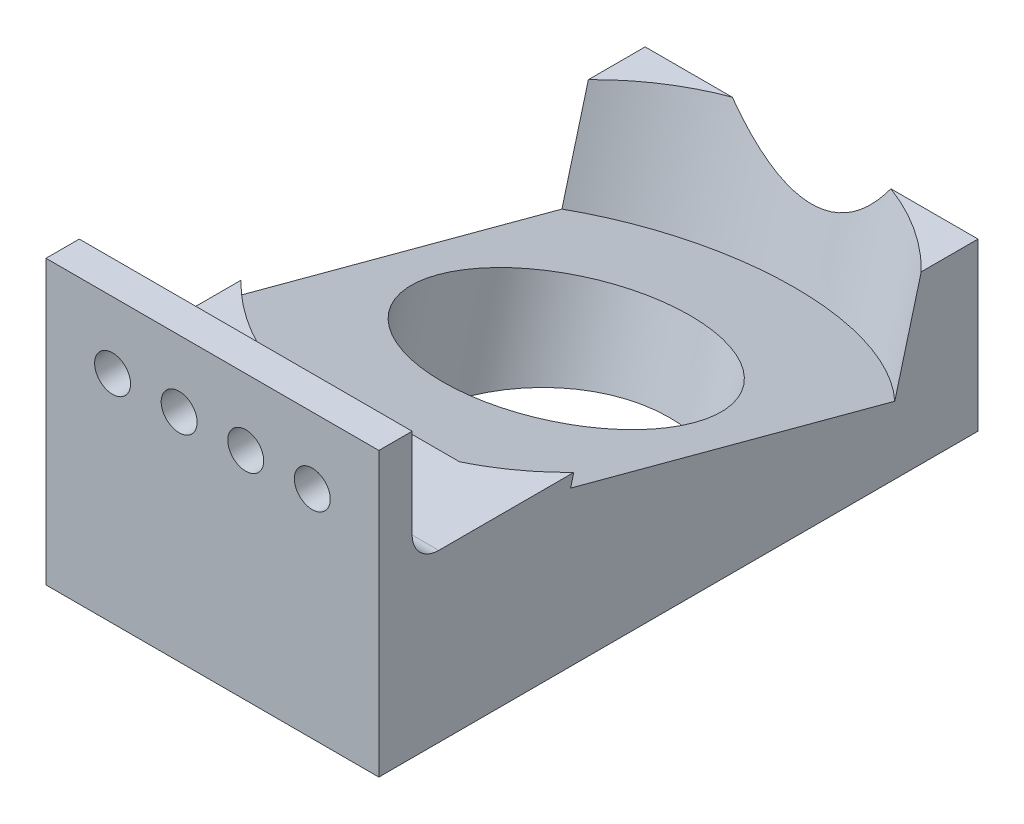
ISO-10303-21;
HEADER;
FILE_DESCRIPTION(('STEP AP214'),'2;1');
FILE_NAME('part.step','',(''),(''),'','','');
FILE_SCHEMA(('AUTOMOTIVE_DESIGN { 1 0 10303 214 1 1 1 1 }'));
ENDSEC;
DATA;
#1=APPLICATION_CONTEXT('core data for automotive mechanical design processes');
#2=APPLICATION_PROTOCOL_DEFINITION('international standard','automotive_design',2000,#1);
#3=PRODUCT_CONTEXT('',#1,'mechanical');
#4=PRODUCT('Part','Part','',(#3));
#5=PRODUCT_RELATED_PRODUCT_CATEGORY('part','',(#4));
#6=PRODUCT_DEFINITION_FORMATION('','',#4);
#7=PRODUCT_DEFINITION_CONTEXT('part definition',#1,'design');
#8=PRODUCT_DEFINITION('design','',#6,#7);
#9=PRODUCT_DEFINITION_SHAPE('','',#8);
#10=(LENGTH_UNIT() NAMED_UNIT(*) SI_UNIT(.MILLI.,.METRE.));
#11=(NAMED_UNIT(*) PLANE_ANGLE_UNIT() SI_UNIT($,.RADIAN.));
#12=(NAMED_UNIT(*) SI_UNIT($,.STERADIAN.) SOLID_ANGLE_UNIT());
#13=UNCERTAINTY_MEASURE_WITH_UNIT(LENGTH_MEASURE(1.E-05),#10,'distance_accuracy_value','');
#14=(GEOMETRIC_REPRESENTATION_CONTEXT(3) GLOBAL_UNCERTAINTY_ASSIGNED_CONTEXT((#13)) GLOBAL_UNIT_ASSIGNED_CONTEXT((#10,
#11,#12)) REPRESENTATION_CONTEXT('',''));
#15=CARTESIAN_POINT('',(0.,0.,0.));
#16=DIRECTION('',(0.,0.,1.));
#17=DIRECTION('',(1.,0.,0.));
#18=AXIS2_PLACEMENT_3D('',#15,#16,#17);
#19=CARTESIAN_POINT('',(31.75,15.875,-53.975));
#20=DIRECTION('',(0.,-1.,0.));
#21=DIRECTION('',(0.,0.,-1.));
#22=AXIS2_PLACEMENT_3D('',#19,#20,#21);
#23=PLANE('',#22);
#24=DIRECTION('',(0.,0.,1.));
#25=VECTOR('',#24,1.);
#26=CARTESIAN_POINT('',(-31.75,15.875,-53.975));
#27=LINE('',#26,#25);
#28=CARTESIAN_POINT('',(-31.75,15.875,-53.975));
#29=VERTEX_POINT('',#28);
#30=CARTESIAN_POINT('',(-31.75,15.875,-43.143798365032));
#31=VERTEX_POINT('',#30);
#32=EDGE_CURVE('E214',#29,#31,#27,.T.);
#33=ORIENTED_EDGE('',*,*,#32,.T.);
#34=CARTESIAN_POINT('',(0.,15.875,-10.0053416035631));
#35=DIRECTION('',(0.,-1.,0.));
#36=DIRECTION('',(0.,0.,1.));
#37=AXIS2_PLACEMENT_3D('',#34,#35,#36);
#38=ELLIPSE('',#37,46.6754265937885,45.085);
#39=CARTESIAN_POINT('',(-15.12729242551,15.875,-53.975));
#40=VERTEX_POINT('',#39);
#41=EDGE_CURVE('E200',#31,#40,#38,.T.);
#42=ORIENTED_EDGE('',*,*,#41,.T.);
#43=DIRECTION('',(-1.,0.,0.));
#44=VECTOR('',#43,1.);
#45=CARTESIAN_POINT('',(31.75,15.875,-53.975));
#46=LINE('',#45,#44);
#47=EDGE_CURVE('E219',#40,#29,#46,.T.);
#48=ORIENTED_EDGE('',*,*,#47,.T.);
#49=EDGE_LOOP('',(#33,#42,#48));
#50=FACE_BOUND('',#49,.T.);
#51=ADVANCED_FACE('F45',(#50),#23,.F.);
#52=CARTESIAN_POINT('',(31.75,15.875,-53.975));
#53=VERTEX_POINT('',#52);
#54=CARTESIAN_POINT('',(15.12729242551,15.875,-53.975));
#55=VERTEX_POINT('',#54);
#56=EDGE_CURVE('E225',#53,#55,#46,.T.);
#57=ORIENTED_EDGE('',*,*,#56,.T.);
#58=CARTESIAN_POINT('',(31.75,15.875,-43.143798365032));
#59=VERTEX_POINT('',#58);
#60=EDGE_CURVE('E205',#55,#59,#38,.T.);
#61=ORIENTED_EDGE('',*,*,#60,.T.);
#62=DIRECTION('',(0.,0.,1.));
#63=VECTOR('',#62,1.);
#64=CARTESIAN_POINT('',(31.75,15.875,-53.975));
#65=LINE('',#64,#63);
#66=EDGE_CURVE('E217',#53,#59,#65,.T.);
#67=ORIENTED_EDGE('',*,*,#66,.F.);
#68=EDGE_LOOP('',(#57,#61,#67));
#69=FACE_BOUND('',#68,.T.);
#70=ADVANCED_FACE('F266',(#69),#23,.F.);
#71=CARTESIAN_POINT('',(31.75,-15.875,-53.975));
#72=DIRECTION('',(0.,1.,0.));
#73=DIRECTION('',(0.,0.,1.));
#74=AXIS2_PLACEMENT_3D('',#71,#72,#73);
#75=PLANE('',#74);
#76=CARTESIAN_POINT('',(0.,-15.875,-1.49795474387514));
#77=DIRECTION('',(0.,1.,0.));
#78=DIRECTION('',(0.,0.,1.));
#79=AXIS2_PLACEMENT_3D('',#76,#77,#78);
#80=ELLIPSE('',#79,25.3099144205755,24.4475);
#81=CARTESIAN_POINT('',(0.,-15.875,23.8119596767003));
#82=VERTEX_POINT('',#81);
#83=EDGE_CURVE('E151',#82,#82,#80,.T.);
#84=ORIENTED_EDGE('',*,*,#83,.T.);
#85=EDGE_LOOP('',(#84));
#86=FACE_BOUND('',#85,.T.);
#87=DIRECTION('',(0.,0.,-1.));
#88=VECTOR('',#87,1.);
#89=CARTESIAN_POINT('',(31.75,-15.875,-53.975));
#90=LINE('',#89,#88);
#91=CARTESIAN_POINT('',(31.75,-15.875,60.325));
#92=VERTEX_POINT('',#91);
#93=CARTESIAN_POINT('',(31.75,-15.875,-53.975));
#94=VERTEX_POINT('',#93);
#95=EDGE_CURVE('E156',#92,#94,#90,.T.);
#96=ORIENTED_EDGE('',*,*,#95,.F.);
#97=DIRECTION('',(1.,0.,0.));
#98=VECTOR('',#97,1.);
#99=CARTESIAN_POINT('',(39.5900098928223,-15.875,60.325));
#100=LINE('',#99,#98);
#101=CARTESIAN_POINT('',(-31.75,-15.875,60.325));
#102=VERTEX_POINT('',#101);
#103=EDGE_CURVE('E154',#102,#92,#100,.T.);
#104=ORIENTED_EDGE('',*,*,#103,.F.);
#105=DIRECTION('',(0.,0.,-1.));
#106=VECTOR('',#105,1.);
#107=CARTESIAN_POINT('',(-31.75,-15.875,-53.975));
#108=LINE('',#107,#106);
#109=CARTESIAN_POINT('',(-31.75,-15.875,-53.975));
#110=VERTEX_POINT('',#109);
#111=EDGE_CURVE('E139',#102,#110,#108,.T.);
#112=ORIENTED_EDGE('',*,*,#111,.T.);
#113=DIRECTION('',(-1.,0.,0.));
#114=VECTOR('',#113,1.);
#115=CARTESIAN_POINT('',(31.75,-15.875,-53.975));
#116=LINE('',#115,#114);
#117=EDGE_CURVE('E228',#94,#110,#116,.T.);
#118=ORIENTED_EDGE('',*,*,#117,.F.);
#119=EDGE_LOOP('',(#96,#104,#112,#118));
#120=FACE_BOUND('',#119,.T.);
#121=ADVANCED_FACE('F155',(#86,#120),#75,.F.);
#122=CARTESIAN_POINT('',(31.75,15.875,-53.975));
#123=DIRECTION('',(0.,0.,1.));
#124=DIRECTION('',(0.,-1.,0.));
#125=AXIS2_PLACEMENT_3D('',#122,#123,#124);
#126=PLANE('',#125);
#127=ORIENTED_EDGE('',*,*,#47,.F.);
#128=CARTESIAN_POINT('',(0.,179.971999126954,-53.9749999999999));
#129=DIRECTION('',(0.,0.,1.));
#130=DIRECTION('',(0.,-1.,0.));
#131=AXIS2_PLACEMENT_3D('',#128,#129,#130);
#132=ELLIPSE('',#131,174.195063512975,45.085);
#133=EDGE_CURVE('E202',#40,#55,#132,.T.);
#134=ORIENTED_EDGE('',*,*,#133,.T.);
#135=ORIENTED_EDGE('',*,*,#56,.F.);
#136=DIRECTION('',(0.,1.,0.));
#137=VECTOR('',#136,1.);
#138=CARTESIAN_POINT('',(31.75,15.875,-53.975));
#139=LINE('',#138,#137);
#140=EDGE_CURVE('E213',#94,#53,#139,.T.);
#141=ORIENTED_EDGE('',*,*,#140,.F.);
#142=ORIENTED_EDGE('',*,*,#117,.T.);
#143=DIRECTION('',(0.,1.,0.));
#144=VECTOR('',#143,1.);
#145=CARTESIAN_POINT('',(-31.75,15.875,-53.975));
#146=LINE('',#145,#144);
#147=EDGE_CURVE('E147',#110,#29,#146,.T.);
#148=ORIENTED_EDGE('',*,*,#147,.T.);
#149=EDGE_LOOP('',(#127,#134,#135,#141,#142,#148));
#150=FACE_BOUND('',#149,.T.);
#151=ADVANCED_FACE('F277',(#150),#126,.F.);
#152=CARTESIAN_POINT('',(-31.75,15.875,23.1331151579059));
#153=VERTEX_POINT('',#152);
#154=CARTESIAN_POINT('',(-31.75,15.875,48.895));
#155=VERTEX_POINT('',#154);
#156=EDGE_CURVE('E222',#153,#155,#27,.T.);
#157=ORIENTED_EDGE('',*,*,#156,.T.);
#158=DIRECTION('',(-1.,0.,0.));
#159=VECTOR('',#158,1.);
#160=CARTESIAN_POINT('',(31.75,15.875,48.895));
#161=LINE('',#160,#159);
#162=CARTESIAN_POINT('',(31.75,15.875,48.895));
#163=VERTEX_POINT('',#162);
#164=EDGE_CURVE('E60',#155,#163,#161,.F.);
#165=ORIENTED_EDGE('',*,*,#164,.T.);
#166=CARTESIAN_POINT('',(31.75,15.875,23.1331151579059));
#167=VERTEX_POINT('',#166);
#168=EDGE_CURVE('E216',#167,#163,#65,.T.);
#169=ORIENTED_EDGE('',*,*,#168,.F.);
#170=CARTESIAN_POINT('',(19.0851798134345,15.875,32.2817700293526));
#171=VERTEX_POINT('',#170);
#172=EDGE_CURVE('E201',#167,#171,#38,.T.);
#173=ORIENTED_EDGE('',*,*,#172,.T.);
#174=DIRECTION('',(-1.,0.,0.));
#175=VECTOR('',#174,1.);
#176=CARTESIAN_POINT('',(31.75,15.875,32.2817700293526));
#177=LINE('',#176,#175);
#178=CARTESIAN_POINT('',(-19.0851798134345,15.875,32.2817700293526));
#179=VERTEX_POINT('',#178);
#180=EDGE_CURVE('E194',#171,#179,#177,.T.);
#181=ORIENTED_EDGE('',*,*,#180,.T.);
#182=EDGE_CURVE('E197',#179,#153,#38,.T.);
#183=ORIENTED_EDGE('',*,*,#182,.T.);
#184=EDGE_LOOP('',(#157,#165,#169,#173,#181,#183));
#185=FACE_BOUND('',#184,.T.);
#186=ADVANCED_FACE('F269',(#185),#23,.F.);
#187=CARTESIAN_POINT('',(31.75,0.,0.));
#188=DIRECTION('',(-1.,0.,0.));
#189=DIRECTION('',(0.,0.,1.));
#190=AXIS2_PLACEMENT_3D('',#187,#188,#189);
#191=PLANE('',#190);
#192=DIRECTION('',(0.,1.,0.));
#193=VECTOR('',#192,1.);
#194=CARTESIAN_POINT('',(31.75,-38.1,60.325));
#195=LINE('',#194,#193);
#196=CARTESIAN_POINT('',(31.75,38.1,60.325));
#197=VERTEX_POINT('',#196);
#198=EDGE_CURVE('E170',#92,#197,#195,.T.);
#199=ORIENTED_EDGE('',*,*,#198,.F.);
#200=ORIENTED_EDGE('',*,*,#95,.T.);
#201=ORIENTED_EDGE('',*,*,#140,.T.);
#202=ORIENTED_EDGE('',*,*,#66,.T.);
#203=DIRECTION('',(0.,-0.96592582628907,0.258819045102514));
#204=VECTOR('',#203,1.);
#205=CARTESIAN_POINT('',(31.75,-29.750057401948,-30.9186010795568));
#206=LINE('',#205,#204);
#207=CARTESIAN_POINT('',(31.75,-2.98139209859573,-38.0912433300489));
#208=VERTEX_POINT('',#207);
#209=EDGE_CURVE('E206',#59,#208,#206,.T.);
#210=ORIENTED_EDGE('',*,*,#209,.T.);
#211=DIRECTION('',(0.,0.258819045102514,0.96592582628907));
#212=VECTOR('',#211,1.);
#213=CARTESIAN_POINT('',(31.75,6.74113413520106,-1.80628144759695));
#214=LINE('',#213,#212);
#215=CARTESIAN_POINT('',(31.75,13.5878362821384,23.7459588290647));
#216=VERTEX_POINT('',#215);
#217=EDGE_CURVE('E191',#208,#216,#214,.T.);
#218=ORIENTED_EDGE('',*,*,#217,.T.);
#219=DIRECTION('',(0.,-0.96592582628907,0.258819045102514));
#220=VECTOR('',#219,1.);
#221=CARTESIAN_POINT('',(31.75,-13.1808290212139,30.9186010795567));
#222=LINE('',#221,#220);
#223=EDGE_CURVE('E209',#216,#167,#222,.F.);
#224=ORIENTED_EDGE('',*,*,#223,.T.);
#225=ORIENTED_EDGE('',*,*,#168,.T.);
#226=CARTESIAN_POINT('',(31.75,20.955,48.895));
#227=DIRECTION('',(-1.,0.,0.));
#228=DIRECTION('',(0.,0.,1.));
#229=AXIS2_PLACEMENT_3D('',#226,#227,#228);
#230=CIRCLE('',#229,5.08);
#231=CARTESIAN_POINT('',(31.75,20.955,53.975));
#232=VERTEX_POINT('',#231);
#233=EDGE_CURVE('E13',#163,#232,#230,.T.);
#234=ORIENTED_EDGE('',*,*,#233,.T.);
#235=DIRECTION('',(0.,1.,0.));
#236=VECTOR('',#235,1.);
#237=CARTESIAN_POINT('',(31.75,-38.1,53.975));
#238=LINE('',#237,#236);
#239=CARTESIAN_POINT('',(31.75,38.1,53.975));
#240=VERTEX_POINT('',#239);
#241=EDGE_CURVE('E174',#232,#240,#238,.T.);
#242=ORIENTED_EDGE('',*,*,#241,.T.);
#243=DIRECTION('',(0.,0.,-1.));
#244=VECTOR('',#243,1.);
#245=CARTESIAN_POINT('',(31.75,38.1,60.325));
#246=LINE('',#245,#244);
#247=EDGE_CURVE('E168',#197,#240,#246,.T.);
#248=ORIENTED_EDGE('',*,*,#247,.F.);
#249=EDGE_LOOP('',(#199,#200,#201,#202,#210,#218,#224,#225,#234,#242,#248));
#250=FACE_BOUND('',#249,.T.);
#251=ADVANCED_FACE('F255',(#250),#191,.F.);
#252=CARTESIAN_POINT('',(-31.75,0.,0.));
#253=DIRECTION('',(-1.,0.,0.));
#254=DIRECTION('',(0.,0.,1.));
#255=AXIS2_PLACEMENT_3D('',#252,#253,#254);
#256=PLANE('',#255);
#257=ORIENTED_EDGE('',*,*,#111,.F.);
#258=DIRECTION('',(0.,-1.,0.));
#259=VECTOR('',#258,1.);
#260=CARTESIAN_POINT('',(-31.75,-38.1,60.325));
#261=LINE('',#260,#259);
#262=CARTESIAN_POINT('',(-31.75,38.1,60.325));
#263=VERTEX_POINT('',#262);
#264=EDGE_CURVE('E144',#263,#102,#261,.T.);
#265=ORIENTED_EDGE('',*,*,#264,.F.);
#266=DIRECTION('',(0.,0.,-1.));
#267=VECTOR('',#266,1.);
#268=CARTESIAN_POINT('',(-31.75,38.1,60.325));
#269=LINE('',#268,#267);
#270=CARTESIAN_POINT('',(-31.75,38.1,53.975));
#271=VERTEX_POINT('',#270);
#272=EDGE_CURVE('E166',#263,#271,#269,.T.);
#273=ORIENTED_EDGE('',*,*,#272,.T.);
#274=DIRECTION('',(0.,-1.,0.));
#275=VECTOR('',#274,1.);
#276=CARTESIAN_POINT('',(-31.75,-38.1,53.975));
#277=LINE('',#276,#275);
#278=CARTESIAN_POINT('',(-31.75,20.955,53.975));
#279=VERTEX_POINT('',#278);
#280=EDGE_CURVE('E179',#271,#279,#277,.T.);
#281=ORIENTED_EDGE('',*,*,#280,.T.);
#282=CARTESIAN_POINT('',(-31.75,20.955,48.895));
#283=DIRECTION('',(-1.,0.,0.));
#284=DIRECTION('',(0.,0.,1.));
#285=AXIS2_PLACEMENT_3D('',#282,#283,#284);
#286=CIRCLE('',#285,5.08);
#287=EDGE_CURVE('E53',#279,#155,#286,.F.);
#288=ORIENTED_EDGE('',*,*,#287,.T.);
#289=ORIENTED_EDGE('',*,*,#156,.F.);
#290=DIRECTION('',(0.,-0.96592582628907,0.258819045102514));
#291=VECTOR('',#290,1.);
#292=CARTESIAN_POINT('',(-31.75,-13.1808290212139,30.9186010795567));
#293=LINE('',#292,#291);
#294=CARTESIAN_POINT('',(-31.75,13.5878362821384,23.7459588290647));
#295=VERTEX_POINT('',#294);
#296=EDGE_CURVE('E232',#295,#153,#293,.F.);
#297=ORIENTED_EDGE('',*,*,#296,.F.);
#298=DIRECTION('',(0.,0.258819045102514,0.96592582628907));
#299=VECTOR('',#298,1.);
#300=CARTESIAN_POINT('',(-31.75,6.74113413520106,-1.80628144759695));
#301=LINE('',#300,#299);
#302=CARTESIAN_POINT('',(-31.75,-2.98139209859573,-38.0912433300489));
#303=VERTEX_POINT('',#302);
#304=EDGE_CURVE('E230',#303,#295,#301,.T.);
#305=ORIENTED_EDGE('',*,*,#304,.F.);
#306=DIRECTION('',(0.,-0.96592582628907,0.258819045102514));
#307=VECTOR('',#306,1.);
#308=CARTESIAN_POINT('',(-31.75,-29.750057401948,-30.9186010795568));
#309=LINE('',#308,#307);
#310=EDGE_CURVE('E234',#31,#303,#309,.T.);
#311=ORIENTED_EDGE('',*,*,#310,.F.);
#312=ORIENTED_EDGE('',*,*,#32,.F.);
#313=ORIENTED_EDGE('',*,*,#147,.F.);
#314=EDGE_LOOP('',(#257,#265,#273,#281,#288,#289,#297,#305,#311,#312,#313));
#315=FACE_BOUND('',#314,.T.);
#316=ADVANCED_FACE('F141',(#315),#256,.T.);
#317=CARTESIAN_POINT('',(0.,-21.465443211581,0.));
#318=DIRECTION('',(0.,-0.96592582628907,0.258819045102514));
#319=DIRECTION('',(0.,-0.258819045102514,-0.96592582628907));
#320=AXIS2_PLACEMENT_3D('',#317,#318,#319);
#321=CYLINDRICAL_SURFACE('',#320,24.4475);
#322=CARTESIAN_POINT('',(0.,5.30322209177131,-7.17264225049207));
#323=DIRECTION('',(0.,-0.96592582628907,0.258819045102514));
#324=DIRECTION('',(0.,-0.258819045102514,-0.96592582628907));
#325=AXIS2_PLACEMENT_3D('',#322,#323,#324);
#326=CIRCLE('',#325,24.4475);
#327=CARTESIAN_POINT('',(0.,-1.0242565133724,-30.7871138886941));
#328=VERTEX_POINT('',#327);
#329=EDGE_CURVE('E183',#328,#328,#326,.T.);
#330=ORIENTED_EDGE('',*,*,#329,.F.);
#331=EDGE_LOOP('',(#330));
#332=FACE_BOUND('',#331,.T.);
#333=ORIENTED_EDGE('',*,*,#83,.F.);
#334=EDGE_LOOP('',(#333));
#335=FACE_BOUND('',#334,.T.);
#336=ADVANCED_FACE('F318',(#332,#335),#321,.F.);
#337=CARTESIAN_POINT('',(0.,-21.465443211581,0.));
#338=DIRECTION('',(0.,-0.96592582628907,0.258819045102514));
#339=DIRECTION('',(0.,-0.258819045102514,-0.96592582628907));
#340=AXIS2_PLACEMENT_3D('',#337,#338,#339);
#341=CYLINDRICAL_SURFACE('',#340,45.085);
#342=ORIENTED_EDGE('',*,*,#223,.F.);
#343=CARTESIAN_POINT('',(0.,5.30322209177132,-7.17264225049208));
#344=DIRECTION('',(0.,-0.96592582628907,0.258819045102514));
#345=DIRECTION('',(0.,-0.258819045102514,-0.96592582628907));
#346=AXIS2_PLACEMENT_3D('',#343,#344,#345);
#347=CIRCLE('',#346,45.085);
#348=EDGE_CURVE('E190',#216,#171,#347,.T.);
#349=ORIENTED_EDGE('',*,*,#348,.T.);
#350=ORIENTED_EDGE('',*,*,#172,.F.);
#351=EDGE_LOOP('',(#342,#349,#350));
#352=FACE_BOUND('',#351,.T.);
#353=ADVANCED_FACE('F297',(#352),#341,.F.);
#354=ORIENTED_EDGE('',*,*,#60,.F.);
#355=ORIENTED_EDGE('',*,*,#133,.F.);
#356=ORIENTED_EDGE('',*,*,#41,.F.);
#357=ORIENTED_EDGE('',*,*,#310,.T.);
#358=EDGE_CURVE('E186',#303,#208,#347,.T.);
#359=ORIENTED_EDGE('',*,*,#358,.T.);
#360=ORIENTED_EDGE('',*,*,#209,.F.);
#361=EDGE_LOOP('',(#354,#355,#356,#357,#359,#360));
#362=FACE_BOUND('',#361,.T.);
#363=ADVANCED_FACE('F305',(#362),#341,.F.);
#364=EDGE_CURVE('E189',#179,#295,#347,.T.);
#365=ORIENTED_EDGE('',*,*,#364,.T.);
#366=ORIENTED_EDGE('',*,*,#296,.T.);
#367=ORIENTED_EDGE('',*,*,#182,.F.);
#368=EDGE_LOOP('',(#365,#366,#367));
#369=FACE_BOUND('',#368,.T.);
#370=ADVANCED_FACE('F290',(#369),#341,.F.);
#371=CARTESIAN_POINT('',(0.,-1.0242565133724,-30.7871138886941));
#372=DIRECTION('',(0.,-0.96592582628907,0.258819045102514));
#373=DIRECTION('',(0.,-0.258819045102514,-0.96592582628907));
#374=AXIS2_PLACEMENT_3D('',#371,#372,#373);
#375=PLANE('',#374);
#376=ORIENTED_EDGE('',*,*,#329,.T.);
#377=EDGE_LOOP('',(#376));
#378=FACE_BOUND('',#377,.T.);
#379=ORIENTED_EDGE('',*,*,#348,.F.);
#380=ORIENTED_EDGE('',*,*,#217,.F.);
#381=ORIENTED_EDGE('',*,*,#358,.F.);
#382=ORIENTED_EDGE('',*,*,#304,.T.);
#383=ORIENTED_EDGE('',*,*,#364,.F.);
#384=ORIENTED_EDGE('',*,*,#180,.F.);
#385=EDGE_LOOP('',(#379,#380,#381,#382,#383,#384));
#386=FACE_BOUND('',#385,.T.);
#387=ADVANCED_FACE('F306',(#378,#386),#375,.F.);
#388=CARTESIAN_POINT('',(0.,0.,60.325));
#389=DIRECTION('',(0.,0.,-1.));
#390=DIRECTION('',(-1.,0.,0.));
#391=AXIS2_PLACEMENT_3D('',#388,#389,#390);
#392=PLANE('',#391);
#393=ORIENTED_EDGE('',*,*,#264,.T.);
#394=ORIENTED_EDGE('',*,*,#103,.T.);
#395=ORIENTED_EDGE('',*,*,#198,.T.);
#396=DIRECTION('',(-1.,0.,0.));
#397=VECTOR('',#396,1.);
#398=CARTESIAN_POINT('',(-31.75,38.1,60.325));
#399=LINE('',#398,#397);
#400=EDGE_CURVE('E164',#197,#263,#399,.T.);
#401=ORIENTED_EDGE('',*,*,#400,.T.);
#402=EDGE_LOOP('',(#393,#394,#395,#401));
#403=FACE_BOUND('',#402,.T.);
#404=CARTESIAN_POINT('',(-19.05,25.4,60.325));
#405=DIRECTION('',(0.,0.,1.));
#406=DIRECTION('',(1.,0.,0.));
#407=AXIS2_PLACEMENT_3D('',#404,#405,#406);
#408=CIRCLE('',#407,3.429);
#409=CARTESIAN_POINT('',(-15.621,25.4,60.325));
#410=VERTEX_POINT('',#409);
#411=EDGE_CURVE('E177',#410,#410,#408,.T.);
#412=ORIENTED_EDGE('',*,*,#411,.F.);
#413=EDGE_LOOP('',(#412));
#414=FACE_BOUND('',#413,.T.);
#415=CARTESIAN_POINT('',(-6.35000000000001,25.4,60.325));
#416=DIRECTION('',(0.,0.,1.));
#417=DIRECTION('',(1.,0.,0.));
#418=AXIS2_PLACEMENT_3D('',#415,#416,#417);
#419=CIRCLE('',#418,3.429);
#420=CARTESIAN_POINT('',(-2.92100000000001,25.4,60.325));
#421=VERTEX_POINT('',#420);
#422=EDGE_CURVE('E477',#421,#421,#419,.T.);
#423=ORIENTED_EDGE('',*,*,#422,.F.);
#424=EDGE_LOOP('',(#423));
#425=FACE_BOUND('',#424,.T.);
#426=CARTESIAN_POINT('',(6.34999999999999,25.4,60.325));
#427=DIRECTION('',(0.,0.,1.));
#428=DIRECTION('',(1.,0.,0.));
#429=AXIS2_PLACEMENT_3D('',#426,#427,#428);
#430=CIRCLE('',#429,3.429);
#431=CARTESIAN_POINT('',(9.77899999999999,25.4,60.325));
#432=VERTEX_POINT('',#431);
#433=EDGE_CURVE('E465',#432,#432,#430,.T.);
#434=ORIENTED_EDGE('',*,*,#433,.F.);
#435=EDGE_LOOP('',(#434));
#436=FACE_BOUND('',#435,.T.);
#437=CARTESIAN_POINT('',(19.05,25.4,60.325));
#438=DIRECTION('',(0.,0.,1.));
#439=DIRECTION('',(1.,0.,0.));
#440=AXIS2_PLACEMENT_3D('',#437,#438,#439);
#441=CIRCLE('',#440,3.429);
#442=CARTESIAN_POINT('',(22.479,25.4,60.325));
#443=VERTEX_POINT('',#442);
#444=EDGE_CURVE('E469',#443,#443,#441,.T.);
#445=ORIENTED_EDGE('',*,*,#444,.F.);
#446=EDGE_LOOP('',(#445));
#447=FACE_BOUND('',#446,.T.);
#448=ADVANCED_FACE('F161',(#403,#414,#425,#436,#447),#392,.F.);
#449=CARTESIAN_POINT('',(0.,0.,53.975));
#450=DIRECTION('',(0.,0.,-1.));
#451=DIRECTION('',(-1.,0.,0.));
#452=AXIS2_PLACEMENT_3D('',#449,#450,#451);
#453=PLANE('',#452);
#454=CARTESIAN_POINT('',(6.34999999999999,25.4,53.975));
#455=DIRECTION('',(0.,0.,1.));
#456=DIRECTION('',(1.,0.,0.));
#457=AXIS2_PLACEMENT_3D('',#454,#455,#456);
#458=CIRCLE('',#457,3.429);
#459=CARTESIAN_POINT('',(9.77899999999999,25.4,53.975));
#460=VERTEX_POINT('',#459);
#461=EDGE_CURVE('E468',#460,#460,#458,.T.);
#462=ORIENTED_EDGE('',*,*,#461,.T.);
#463=EDGE_LOOP('',(#462));
#464=FACE_BOUND('',#463,.T.);
#465=CARTESIAN_POINT('',(-19.05,25.4,53.975));
#466=DIRECTION('',(0.,0.,1.));
#467=DIRECTION('',(1.,0.,0.));
#468=AXIS2_PLACEMENT_3D('',#465,#466,#467);
#469=CIRCLE('',#468,3.429);
#470=CARTESIAN_POINT('',(-15.621,25.4,53.975));
#471=VERTEX_POINT('',#470);
#472=EDGE_CURVE('E480',#471,#471,#469,.T.);
#473=ORIENTED_EDGE('',*,*,#472,.T.);
#474=EDGE_LOOP('',(#473));
#475=FACE_BOUND('',#474,.T.);
#476=ORIENTED_EDGE('',*,*,#241,.F.);
#477=DIRECTION('',(-1.,0.,0.));
#478=VECTOR('',#477,1.);
#479=CARTESIAN_POINT('',(0.,20.955,53.975));
#480=LINE('',#479,#478);
#481=EDGE_CURVE('E237',#232,#279,#480,.T.);
#482=ORIENTED_EDGE('',*,*,#481,.T.);
#483=ORIENTED_EDGE('',*,*,#280,.F.);
#484=DIRECTION('',(-1.,0.,0.));
#485=VECTOR('',#484,1.);
#486=CARTESIAN_POINT('',(-31.75,38.1,53.975));
#487=LINE('',#486,#485);
#488=EDGE_CURVE('E176',#240,#271,#487,.T.);
#489=ORIENTED_EDGE('',*,*,#488,.F.);
#490=EDGE_LOOP('',(#476,#482,#483,#489));
#491=FACE_BOUND('',#490,.T.);
#492=CARTESIAN_POINT('',(-6.35000000000001,25.4,53.975));
#493=DIRECTION('',(0.,0.,1.));
#494=DIRECTION('',(1.,0.,0.));
#495=AXIS2_PLACEMENT_3D('',#492,#493,#494);
#496=CIRCLE('',#495,3.429);
#497=CARTESIAN_POINT('',(-2.92100000000001,25.4,53.975));
#498=VERTEX_POINT('',#497);
#499=EDGE_CURVE('E471',#498,#498,#496,.T.);
#500=ORIENTED_EDGE('',*,*,#499,.T.);
#501=EDGE_LOOP('',(#500));
#502=FACE_BOUND('',#501,.T.);
#503=CARTESIAN_POINT('',(19.05,25.4,53.975));
#504=DIRECTION('',(0.,0.,1.));
#505=DIRECTION('',(1.,0.,0.));
#506=AXIS2_PLACEMENT_3D('',#503,#504,#505);
#507=CIRCLE('',#506,3.429);
#508=CARTESIAN_POINT('',(22.479,25.4,53.975));
#509=VERTEX_POINT('',#508);
#510=EDGE_CURVE('E159',#509,#509,#507,.T.);
#511=ORIENTED_EDGE('',*,*,#510,.T.);
#512=EDGE_LOOP('',(#511));
#513=FACE_BOUND('',#512,.T.);
#514=ADVANCED_FACE('F246',(#464,#475,#491,#502,#513),#453,.T.);
#515=CARTESIAN_POINT('',(-31.75,38.1,60.325));
#516=DIRECTION('',(0.,-1.,0.));
#517=DIRECTION('',(0.,0.,-1.));
#518=AXIS2_PLACEMENT_3D('',#515,#516,#517);
#519=PLANE('',#518);
#520=ORIENTED_EDGE('',*,*,#488,.T.);
#521=ORIENTED_EDGE('',*,*,#272,.F.);
#522=ORIENTED_EDGE('',*,*,#400,.F.);
#523=ORIENTED_EDGE('',*,*,#247,.T.);
#524=EDGE_LOOP('',(#520,#521,#522,#523));
#525=FACE_BOUND('',#524,.T.);
#526=ADVANCED_FACE('F252',(#525),#519,.F.);
#527=CARTESIAN_POINT('',(-19.05,25.4,60.325));
#528=DIRECTION('',(0.,0.,-1.));
#529=DIRECTION('',(-1.,0.,0.));
#530=AXIS2_PLACEMENT_3D('',#527,#528,#529);
#531=CYLINDRICAL_SURFACE('',#530,3.429);
#532=ORIENTED_EDGE('',*,*,#411,.T.);
#533=EDGE_LOOP('',(#532));
#534=FACE_BOUND('',#533,.T.);
#535=ORIENTED_EDGE('',*,*,#472,.F.);
#536=EDGE_LOOP('',(#535));
#537=FACE_BOUND('',#536,.T.);
#538=ADVANCED_FACE('F374',(#534,#537),#531,.F.);
#539=CARTESIAN_POINT('',(-6.35000000000001,25.4,60.325));
#540=DIRECTION('',(0.,0.,-1.));
#541=DIRECTION('',(-1.,0.,0.));
#542=AXIS2_PLACEMENT_3D('',#539,#540,#541);
#543=CYLINDRICAL_SURFACE('',#542,3.429);
#544=ORIENTED_EDGE('',*,*,#422,.T.);
#545=EDGE_LOOP('',(#544));
#546=FACE_BOUND('',#545,.T.);
#547=ORIENTED_EDGE('',*,*,#499,.F.);
#548=EDGE_LOOP('',(#547));
#549=FACE_BOUND('',#548,.T.);
#550=ADVANCED_FACE('F381',(#546,#549),#543,.F.);
#551=CARTESIAN_POINT('',(6.34999999999999,25.4,60.325));
#552=DIRECTION('',(0.,0.,-1.));
#553=DIRECTION('',(-1.,0.,0.));
#554=AXIS2_PLACEMENT_3D('',#551,#552,#553);
#555=CYLINDRICAL_SURFACE('',#554,3.429);
#556=ORIENTED_EDGE('',*,*,#433,.T.);
#557=EDGE_LOOP('',(#556));
#558=FACE_BOUND('',#557,.T.);
#559=ORIENTED_EDGE('',*,*,#461,.F.);
#560=EDGE_LOOP('',(#559));
#561=FACE_BOUND('',#560,.T.);
#562=ADVANCED_FACE('F262',(#558,#561),#555,.F.);
#563=CARTESIAN_POINT('',(19.05,25.4,60.325));
#564=DIRECTION('',(0.,0.,-1.));
#565=DIRECTION('',(-1.,0.,0.));
#566=AXIS2_PLACEMENT_3D('',#563,#564,#565);
#567=CYLINDRICAL_SURFACE('',#566,3.429);
#568=ORIENTED_EDGE('',*,*,#444,.T.);
#569=EDGE_LOOP('',(#568));
#570=FACE_BOUND('',#569,.T.);
#571=ORIENTED_EDGE('',*,*,#510,.F.);
#572=EDGE_LOOP('',(#571));
#573=FACE_BOUND('',#572,.T.);
#574=ADVANCED_FACE('F257',(#570,#573),#567,.F.);
#575=CARTESIAN_POINT('',(0.,20.955,48.895));
#576=DIRECTION('',(-1.,0.,0.));
#577=DIRECTION('',(0.,0.,1.));
#578=AXIS2_PLACEMENT_3D('',#575,#576,#577);
#579=CYLINDRICAL_SURFACE('',#578,5.08);
#580=ORIENTED_EDGE('',*,*,#233,.F.);
#581=ORIENTED_EDGE('',*,*,#164,.F.);
#582=ORIENTED_EDGE('',*,*,#287,.F.);
#583=ORIENTED_EDGE('',*,*,#481,.F.);
#584=EDGE_LOOP('',(#580,#581,#582,#583));
#585=FACE_BOUND('',#584,.T.);
#586=ADVANCED_FACE('F47',(#585),#579,.F.);
#587=CLOSED_SHELL('',(#51,#70,#121,#151,#186,#251,#316,#336,#353,#363,#370,#387,#448,#514,#526,
#538,#550,#562,#574,#586));
#588=MANIFOLD_SOLID_BREP('B2',#587);
#589=ADVANCED_BREP_SHAPE_REPRESENTATION('',(#18,#588),#14);
#590=SHAPE_DEFINITION_REPRESENTATION(#9,#589);
ENDSEC;
END-ISO-10303-21;
